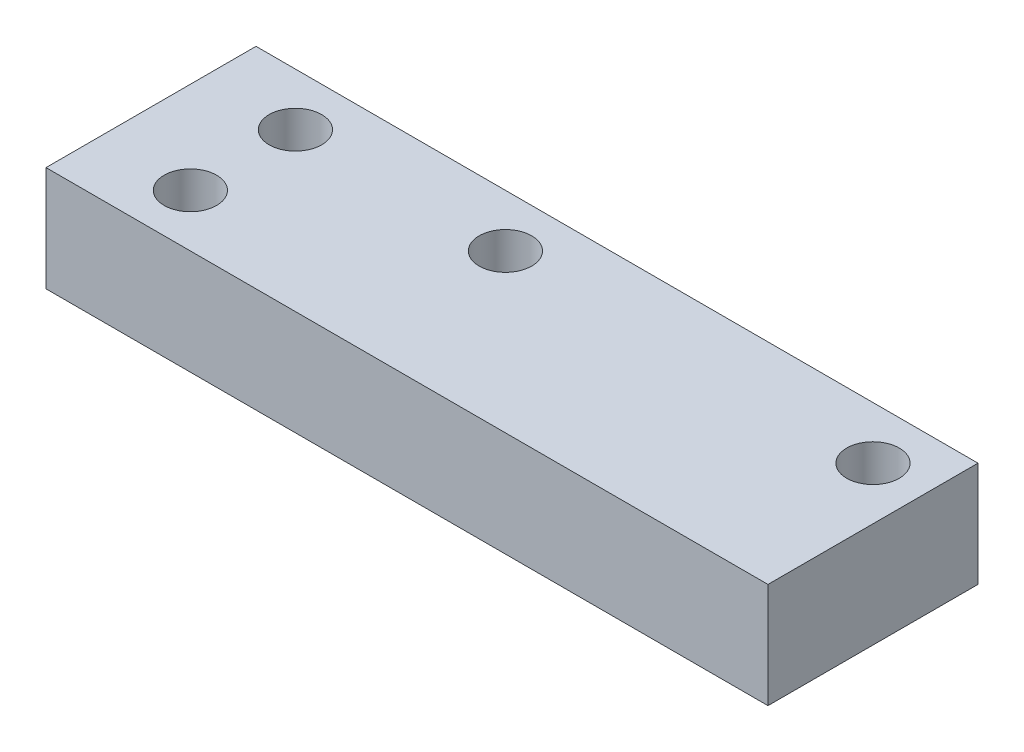
ISO-10303-21;
HEADER;
FILE_DESCRIPTION(('STEP AP214'),'2;1');
FILE_NAME('part.step','',(''),(''),'','','');
FILE_SCHEMA(('AUTOMOTIVE_DESIGN { 1 0 10303 214 1 1 1 1 }'));
ENDSEC;
DATA;
#1=APPLICATION_CONTEXT('core data for automotive mechanical design processes');
#2=APPLICATION_PROTOCOL_DEFINITION('international standard','automotive_design',2000,#1);
#3=PRODUCT_CONTEXT('',#1,'mechanical');
#4=PRODUCT('Part','Part','',(#3));
#5=PRODUCT_RELATED_PRODUCT_CATEGORY('part','',(#4));
#6=PRODUCT_DEFINITION_FORMATION('','',#4);
#7=PRODUCT_DEFINITION_CONTEXT('part definition',#1,'design');
#8=PRODUCT_DEFINITION('design','',#6,#7);
#9=PRODUCT_DEFINITION_SHAPE('','',#8);
#10=(LENGTH_UNIT() NAMED_UNIT(*) SI_UNIT(.MILLI.,.METRE.));
#11=(NAMED_UNIT(*) PLANE_ANGLE_UNIT() SI_UNIT($,.RADIAN.));
#12=(NAMED_UNIT(*) SI_UNIT($,.STERADIAN.) SOLID_ANGLE_UNIT());
#13=UNCERTAINTY_MEASURE_WITH_UNIT(LENGTH_MEASURE(1.E-05),#10,'distance_accuracy_value','');
#14=(GEOMETRIC_REPRESENTATION_CONTEXT(3) GLOBAL_UNCERTAINTY_ASSIGNED_CONTEXT((#13)) GLOBAL_UNIT_ASSIGNED_CONTEXT((#10,
#11,#12)) REPRESENTATION_CONTEXT('',''));
#15=CARTESIAN_POINT('',(0.,0.,0.));
#16=DIRECTION('',(0.,0.,1.));
#17=DIRECTION('',(1.,0.,0.));
#18=AXIS2_PLACEMENT_3D('',#15,#16,#17);
#19=CARTESIAN_POINT('',(0.,8.,0.));
#20=DIRECTION('',(0.,1.,0.));
#21=DIRECTION('',(0.,0.,1.));
#22=AXIS2_PLACEMENT_3D('',#19,#20,#21);
#23=PLANE('',#22);
#24=CARTESIAN_POINT('',(7.,8.,4.));
#25=DIRECTION('',(0.,1.,0.));
#26=DIRECTION('',(0.,0.,1.));
#27=AXIS2_PLACEMENT_3D('',#24,#25,#26);
#28=CIRCLE('',#27,2.);
#29=CARTESIAN_POINT('',(7.,8.,6.));
#30=VERTEX_POINT('',#29);
#31=EDGE_CURVE('E141',#30,#30,#28,.T.);
#32=ORIENTED_EDGE('',*,*,#31,.F.);
#33=EDGE_LOOP('',(#32));
#34=FACE_BOUND('',#33,.T.);
#35=CARTESIAN_POINT('',(23.,8.,4.));
#36=DIRECTION('',(0.,1.,0.));
#37=DIRECTION('',(0.,0.,1.));
#38=AXIS2_PLACEMENT_3D('',#35,#36,#37);
#39=CIRCLE('',#38,2.);
#40=CARTESIAN_POINT('',(23.,8.,6.));
#41=VERTEX_POINT('',#40);
#42=EDGE_CURVE('E111',#41,#41,#39,.T.);
#43=ORIENTED_EDGE('',*,*,#42,.F.);
#44=EDGE_LOOP('',(#43));
#45=FACE_BOUND('',#44,.T.);
#46=DIRECTION('',(0.,0.,1.));
#47=VECTOR('',#46,1.);
#48=CARTESIAN_POINT('',(0.,8.,0.));
#49=LINE('',#48,#47);
#50=CARTESIAN_POINT('',(0.,8.,0.));
#51=VERTEX_POINT('',#50);
#52=CARTESIAN_POINT('',(0.,8.,16.));
#53=VERTEX_POINT('',#52);
#54=EDGE_CURVE('E91',#51,#53,#49,.T.);
#55=ORIENTED_EDGE('',*,*,#54,.T.);
#56=DIRECTION('',(1.,0.,0.));
#57=VECTOR('',#56,1.);
#58=CARTESIAN_POINT('',(0.,8.,16.));
#59=LINE('',#58,#57);
#60=CARTESIAN_POINT('',(55.,8.,16.));
#61=VERTEX_POINT('',#60);
#62=EDGE_CURVE('E86',#53,#61,#59,.T.);
#63=ORIENTED_EDGE('',*,*,#62,.T.);
#64=DIRECTION('',(0.,0.,-1.));
#65=VECTOR('',#64,1.);
#66=CARTESIAN_POINT('',(55.,8.,0.));
#67=LINE('',#66,#65);
#68=CARTESIAN_POINT('',(55.,8.,0.));
#69=VERTEX_POINT('',#68);
#70=EDGE_CURVE('E89',#61,#69,#67,.T.);
#71=ORIENTED_EDGE('',*,*,#70,.T.);
#72=DIRECTION('',(-1.,0.,0.));
#73=VECTOR('',#72,1.);
#74=CARTESIAN_POINT('',(0.,8.,0.));
#75=LINE('',#74,#73);
#76=EDGE_CURVE('E56',#69,#51,#75,.T.);
#77=ORIENTED_EDGE('',*,*,#76,.T.);
#78=EDGE_LOOP('',(#55,#63,#71,#77));
#79=FACE_BOUND('',#78,.T.);
#80=CARTESIAN_POINT('',(51.,8.,4.));
#81=DIRECTION('',(0.,1.,0.));
#82=DIRECTION('',(0.,0.,1.));
#83=AXIS2_PLACEMENT_3D('',#80,#81,#82);
#84=CIRCLE('',#83,2.);
#85=CARTESIAN_POINT('',(51.,8.,6.));
#86=VERTEX_POINT('',#85);
#87=EDGE_CURVE('E133',#86,#86,#84,.T.);
#88=ORIENTED_EDGE('',*,*,#87,.F.);
#89=EDGE_LOOP('',(#88));
#90=FACE_BOUND('',#89,.T.);
#91=CARTESIAN_POINT('',(7.,8.,12.));
#92=DIRECTION('',(0.,1.,0.));
#93=DIRECTION('',(0.,0.,1.));
#94=AXIS2_PLACEMENT_3D('',#91,#92,#93);
#95=CIRCLE('',#94,2.);
#96=CARTESIAN_POINT('',(7.,8.,14.));
#97=VERTEX_POINT('',#96);
#98=EDGE_CURVE('E149',#97,#97,#95,.T.);
#99=ORIENTED_EDGE('',*,*,#98,.F.);
#100=EDGE_LOOP('',(#99));
#101=FACE_BOUND('',#100,.T.);
#102=ADVANCED_FACE('F38',(#34,#45,#79,#90,#101),#23,.T.);
#103=CARTESIAN_POINT('',(0.,0.,0.));
#104=DIRECTION('',(0.,1.,0.));
#105=DIRECTION('',(0.,0.,1.));
#106=AXIS2_PLACEMENT_3D('',#103,#104,#105);
#107=PLANE('',#106);
#108=DIRECTION('',(0.,0.,1.));
#109=VECTOR('',#108,1.);
#110=CARTESIAN_POINT('',(0.,0.,0.));
#111=LINE('',#110,#109);
#112=CARTESIAN_POINT('',(0.,0.,0.));
#113=VERTEX_POINT('',#112);
#114=CARTESIAN_POINT('',(0.,0.,16.));
#115=VERTEX_POINT('',#114);
#116=EDGE_CURVE('E107',#113,#115,#111,.T.);
#117=ORIENTED_EDGE('',*,*,#116,.F.);
#118=DIRECTION('',(-1.,0.,0.));
#119=VECTOR('',#118,1.);
#120=CARTESIAN_POINT('',(0.,0.,0.));
#121=LINE('',#120,#119);
#122=CARTESIAN_POINT('',(55.,0.,0.));
#123=VERTEX_POINT('',#122);
#124=EDGE_CURVE('E79',#123,#113,#121,.T.);
#125=ORIENTED_EDGE('',*,*,#124,.F.);
#126=DIRECTION('',(0.,0.,-1.));
#127=VECTOR('',#126,1.);
#128=CARTESIAN_POINT('',(55.,0.,0.));
#129=LINE('',#128,#127);
#130=CARTESIAN_POINT('',(55.,0.,16.));
#131=VERTEX_POINT('',#130);
#132=EDGE_CURVE('E73',#131,#123,#129,.T.);
#133=ORIENTED_EDGE('',*,*,#132,.F.);
#134=DIRECTION('',(1.,0.,0.));
#135=VECTOR('',#134,1.);
#136=CARTESIAN_POINT('',(0.,0.,16.));
#137=LINE('',#136,#135);
#138=EDGE_CURVE('E96',#115,#131,#137,.T.);
#139=ORIENTED_EDGE('',*,*,#138,.F.);
#140=EDGE_LOOP('',(#117,#125,#133,#139));
#141=FACE_BOUND('',#140,.T.);
#142=CARTESIAN_POINT('',(23.,0.,4.));
#143=DIRECTION('',(0.,1.,0.));
#144=DIRECTION('',(0.,0.,1.));
#145=AXIS2_PLACEMENT_3D('',#142,#143,#144);
#146=CIRCLE('',#145,2.);
#147=CARTESIAN_POINT('',(23.,0.,6.));
#148=VERTEX_POINT('',#147);
#149=EDGE_CURVE('E129',#148,#148,#146,.T.);
#150=ORIENTED_EDGE('',*,*,#149,.T.);
#151=EDGE_LOOP('',(#150));
#152=FACE_BOUND('',#151,.T.);
#153=CARTESIAN_POINT('',(51.,0.,4.));
#154=DIRECTION('',(0.,1.,0.));
#155=DIRECTION('',(0.,0.,1.));
#156=AXIS2_PLACEMENT_3D('',#153,#154,#155);
#157=CIRCLE('',#156,2.);
#158=CARTESIAN_POINT('',(51.,0.,6.));
#159=VERTEX_POINT('',#158);
#160=EDGE_CURVE('E137',#159,#159,#157,.T.);
#161=ORIENTED_EDGE('',*,*,#160,.T.);
#162=EDGE_LOOP('',(#161));
#163=FACE_BOUND('',#162,.T.);
#164=CARTESIAN_POINT('',(7.,0.,4.));
#165=DIRECTION('',(0.,1.,0.));
#166=DIRECTION('',(0.,0.,1.));
#167=AXIS2_PLACEMENT_3D('',#164,#165,#166);
#168=CIRCLE('',#167,2.);
#169=CARTESIAN_POINT('',(7.,0.,6.));
#170=VERTEX_POINT('',#169);
#171=EDGE_CURVE('E145',#170,#170,#168,.T.);
#172=ORIENTED_EDGE('',*,*,#171,.T.);
#173=EDGE_LOOP('',(#172));
#174=FACE_BOUND('',#173,.T.);
#175=CARTESIAN_POINT('',(7.,0.,12.));
#176=DIRECTION('',(0.,1.,0.));
#177=DIRECTION('',(0.,0.,1.));
#178=AXIS2_PLACEMENT_3D('',#175,#176,#177);
#179=CIRCLE('',#178,2.);
#180=CARTESIAN_POINT('',(7.,0.,14.));
#181=VERTEX_POINT('',#180);
#182=EDGE_CURVE('E153',#181,#181,#179,.T.);
#183=ORIENTED_EDGE('',*,*,#182,.T.);
#184=EDGE_LOOP('',(#183));
#185=FACE_BOUND('',#184,.T.);
#186=ADVANCED_FACE('F124',(#141,#152,#163,#174,#185),#107,.F.);
#187=CARTESIAN_POINT('',(0.,8.,0.));
#188=DIRECTION('',(1.,0.,0.));
#189=DIRECTION('',(0.,0.,-1.));
#190=AXIS2_PLACEMENT_3D('',#187,#188,#189);
#191=PLANE('',#190);
#192=ORIENTED_EDGE('',*,*,#116,.T.);
#193=DIRECTION('',(0.,-1.,0.));
#194=VECTOR('',#193,1.);
#195=CARTESIAN_POINT('',(0.,8.,16.));
#196=LINE('',#195,#194);
#197=EDGE_CURVE('E11',#53,#115,#196,.T.);
#198=ORIENTED_EDGE('',*,*,#197,.F.);
#199=ORIENTED_EDGE('',*,*,#54,.F.);
#200=DIRECTION('',(0.,-1.,0.));
#201=VECTOR('',#200,1.);
#202=CARTESIAN_POINT('',(0.,8.,0.));
#203=LINE('',#202,#201);
#204=EDGE_CURVE('E103',#51,#113,#203,.T.);
#205=ORIENTED_EDGE('',*,*,#204,.T.);
#206=EDGE_LOOP('',(#192,#198,#199,#205));
#207=FACE_BOUND('',#206,.T.);
#208=ADVANCED_FACE('F40',(#207),#191,.F.);
#209=CARTESIAN_POINT('',(0.,8.,16.));
#210=DIRECTION('',(0.,0.,-1.));
#211=DIRECTION('',(-1.,0.,0.));
#212=AXIS2_PLACEMENT_3D('',#209,#210,#211);
#213=PLANE('',#212);
#214=ORIENTED_EDGE('',*,*,#138,.T.);
#215=DIRECTION('',(0.,-1.,0.));
#216=VECTOR('',#215,1.);
#217=CARTESIAN_POINT('',(55.,8.,16.));
#218=LINE('',#217,#216);
#219=EDGE_CURVE('E48',#61,#131,#218,.T.);
#220=ORIENTED_EDGE('',*,*,#219,.F.);
#221=ORIENTED_EDGE('',*,*,#62,.F.);
#222=ORIENTED_EDGE('',*,*,#197,.T.);
#223=EDGE_LOOP('',(#214,#220,#221,#222));
#224=FACE_BOUND('',#223,.T.);
#225=ADVANCED_FACE('F95',(#224),#213,.F.);
#226=CARTESIAN_POINT('',(55.,8.,0.));
#227=DIRECTION('',(-1.,0.,0.));
#228=DIRECTION('',(0.,0.,1.));
#229=AXIS2_PLACEMENT_3D('',#226,#227,#228);
#230=PLANE('',#229);
#231=ORIENTED_EDGE('',*,*,#132,.T.);
#232=DIRECTION('',(0.,-1.,0.));
#233=VECTOR('',#232,1.);
#234=CARTESIAN_POINT('',(55.,8.,0.));
#235=LINE('',#234,#233);
#236=EDGE_CURVE('E98',#69,#123,#235,.T.);
#237=ORIENTED_EDGE('',*,*,#236,.F.);
#238=ORIENTED_EDGE('',*,*,#70,.F.);
#239=ORIENTED_EDGE('',*,*,#219,.T.);
#240=EDGE_LOOP('',(#231,#237,#238,#239));
#241=FACE_BOUND('',#240,.T.);
#242=ADVANCED_FACE('F99',(#241),#230,.F.);
#243=CARTESIAN_POINT('',(0.,8.,0.));
#244=DIRECTION('',(0.,0.,1.));
#245=DIRECTION('',(1.,0.,0.));
#246=AXIS2_PLACEMENT_3D('',#243,#244,#245);
#247=PLANE('',#246);
#248=ORIENTED_EDGE('',*,*,#124,.T.);
#249=ORIENTED_EDGE('',*,*,#204,.F.);
#250=ORIENTED_EDGE('',*,*,#76,.F.);
#251=ORIENTED_EDGE('',*,*,#236,.T.);
#252=EDGE_LOOP('',(#248,#249,#250,#251));
#253=FACE_BOUND('',#252,.T.);
#254=ADVANCED_FACE('F121',(#253),#247,.F.);
#255=CARTESIAN_POINT('',(23.,8.,4.));
#256=DIRECTION('',(0.,-1.,0.));
#257=DIRECTION('',(0.,0.,-1.));
#258=AXIS2_PLACEMENT_3D('',#255,#256,#257);
#259=CYLINDRICAL_SURFACE('',#258,2.);
#260=ORIENTED_EDGE('',*,*,#42,.T.);
#261=EDGE_LOOP('',(#260));
#262=FACE_BOUND('',#261,.T.);
#263=ORIENTED_EDGE('',*,*,#149,.F.);
#264=EDGE_LOOP('',(#263));
#265=FACE_BOUND('',#264,.T.);
#266=ADVANCED_FACE('F174',(#262,#265),#259,.F.);
#267=CARTESIAN_POINT('',(51.,8.,4.));
#268=DIRECTION('',(0.,-1.,0.));
#269=DIRECTION('',(0.,0.,-1.));
#270=AXIS2_PLACEMENT_3D('',#267,#268,#269);
#271=CYLINDRICAL_SURFACE('',#270,2.);
#272=ORIENTED_EDGE('',*,*,#87,.T.);
#273=EDGE_LOOP('',(#272));
#274=FACE_BOUND('',#273,.T.);
#275=ORIENTED_EDGE('',*,*,#160,.F.);
#276=EDGE_LOOP('',(#275));
#277=FACE_BOUND('',#276,.T.);
#278=ADVANCED_FACE('F220',(#274,#277),#271,.F.);
#279=CARTESIAN_POINT('',(7.,8.,4.));
#280=DIRECTION('',(0.,-1.,0.));
#281=DIRECTION('',(0.,0.,-1.));
#282=AXIS2_PLACEMENT_3D('',#279,#280,#281);
#283=CYLINDRICAL_SURFACE('',#282,2.);
#284=ORIENTED_EDGE('',*,*,#31,.T.);
#285=EDGE_LOOP('',(#284));
#286=FACE_BOUND('',#285,.T.);
#287=ORIENTED_EDGE('',*,*,#171,.F.);
#288=EDGE_LOOP('',(#287));
#289=FACE_BOUND('',#288,.T.);
#290=ADVANCED_FACE('F228',(#286,#289),#283,.F.);
#291=CARTESIAN_POINT('',(7.,8.,12.));
#292=DIRECTION('',(0.,-1.,0.));
#293=DIRECTION('',(0.,0.,-1.));
#294=AXIS2_PLACEMENT_3D('',#291,#292,#293);
#295=CYLINDRICAL_SURFACE('',#294,2.);
#296=ORIENTED_EDGE('',*,*,#98,.T.);
#297=EDGE_LOOP('',(#296));
#298=FACE_BOUND('',#297,.T.);
#299=ORIENTED_EDGE('',*,*,#182,.F.);
#300=EDGE_LOOP('',(#299));
#301=FACE_BOUND('',#300,.T.);
#302=ADVANCED_FACE('F161',(#298,#301),#295,.F.);
#303=CLOSED_SHELL('',(#102,#186,#208,#225,#242,#254,#266,#278,#290,#302));
#304=MANIFOLD_SOLID_BREP('B2',#303);
#305=ADVANCED_BREP_SHAPE_REPRESENTATION('',(#18,#304),#14);
#306=SHAPE_DEFINITION_REPRESENTATION(#9,#305);
ENDSEC;
END-ISO-10303-21;
